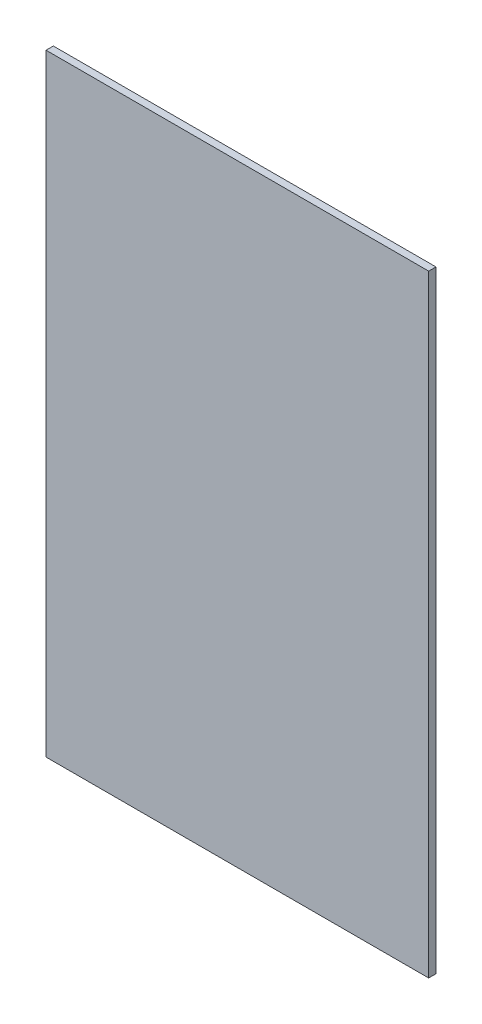
ISO-10303-21;
HEADER;
FILE_DESCRIPTION(('STEP AP214'),'2;1');
FILE_NAME('part.step','',(''),(''),'','','');
FILE_SCHEMA(('AUTOMOTIVE_DESIGN { 1 0 10303 214 1 1 1 1 }'));
ENDSEC;
DATA;
#1=APPLICATION_CONTEXT('core data for automotive mechanical design processes');
#2=APPLICATION_PROTOCOL_DEFINITION('international standard','automotive_design',2000,#1);
#3=PRODUCT_CONTEXT('',#1,'mechanical');
#4=PRODUCT('Part','Part','',(#3));
#5=PRODUCT_RELATED_PRODUCT_CATEGORY('part','',(#4));
#6=PRODUCT_DEFINITION_FORMATION('','',#4);
#7=PRODUCT_DEFINITION_CONTEXT('part definition',#1,'design');
#8=PRODUCT_DEFINITION('design','',#6,#7);
#9=PRODUCT_DEFINITION_SHAPE('','',#8);
#10=(LENGTH_UNIT() NAMED_UNIT(*) SI_UNIT(.MILLI.,.METRE.));
#11=(NAMED_UNIT(*) PLANE_ANGLE_UNIT() SI_UNIT($,.RADIAN.));
#12=(NAMED_UNIT(*) SI_UNIT($,.STERADIAN.) SOLID_ANGLE_UNIT());
#13=UNCERTAINTY_MEASURE_WITH_UNIT(LENGTH_MEASURE(1.E-05),#10,'distance_accuracy_value','');
#14=(GEOMETRIC_REPRESENTATION_CONTEXT(3) GLOBAL_UNCERTAINTY_ASSIGNED_CONTEXT((#13)) GLOBAL_UNIT_ASSIGNED_CONTEXT((#10,
#11,#12)) REPRESENTATION_CONTEXT('',''));
#15=CARTESIAN_POINT('',(0.,0.,0.));
#16=DIRECTION('',(0.,0.,1.));
#17=DIRECTION('',(1.,0.,0.));
#18=AXIS2_PLACEMENT_3D('',#15,#16,#17);
#19=CARTESIAN_POINT('',(0.,0.,8.));
#20=DIRECTION('',(1.,0.,0.));
#21=DIRECTION('',(0.,0.,-1.));
#22=AXIS2_PLACEMENT_3D('',#19,#20,#21);
#23=PLANE('',#22);
#24=DIRECTION('',(0.,-1.,0.));
#25=VECTOR('',#24,1.);
#26=CARTESIAN_POINT('',(0.,0.,0.));
#27=LINE('',#26,#25);
#28=CARTESIAN_POINT('',(0.,672.,0.));
#29=VERTEX_POINT('',#28);
#30=CARTESIAN_POINT('',(0.,0.,0.));
#31=VERTEX_POINT('',#30);
#32=EDGE_CURVE('E102',#29,#31,#27,.T.);
#33=ORIENTED_EDGE('',*,*,#32,.T.);
#34=DIRECTION('',(0.,0.,-1.));
#35=VECTOR('',#34,1.);
#36=CARTESIAN_POINT('',(0.,0.,8.));
#37=LINE('',#36,#35);
#38=CARTESIAN_POINT('',(0.,0.,8.));
#39=VERTEX_POINT('',#38);
#40=EDGE_CURVE('E11',#39,#31,#37,.T.);
#41=ORIENTED_EDGE('',*,*,#40,.F.);
#42=DIRECTION('',(0.,-1.,0.));
#43=VECTOR('',#42,1.);
#44=CARTESIAN_POINT('',(0.,0.,8.));
#45=LINE('',#44,#43);
#46=CARTESIAN_POINT('',(0.,672.,8.));
#47=VERTEX_POINT('',#46);
#48=EDGE_CURVE('E90',#47,#39,#45,.T.);
#49=ORIENTED_EDGE('',*,*,#48,.F.);
#50=DIRECTION('',(0.,0.,-1.));
#51=VECTOR('',#50,1.);
#52=CARTESIAN_POINT('',(0.,672.,8.));
#53=LINE('',#52,#51);
#54=EDGE_CURVE('E98',#47,#29,#53,.T.);
#55=ORIENTED_EDGE('',*,*,#54,.T.);
#56=EDGE_LOOP('',(#33,#41,#49,#55));
#57=FACE_BOUND('',#56,.T.);
#58=ADVANCED_FACE('F39',(#57),#23,.F.);
#59=CARTESIAN_POINT('',(0.,0.,8.));
#60=DIRECTION('',(0.,1.,0.));
#61=DIRECTION('',(0.,0.,1.));
#62=AXIS2_PLACEMENT_3D('',#59,#60,#61);
#63=PLANE('',#62);
#64=DIRECTION('',(1.,0.,0.));
#65=VECTOR('',#64,1.);
#66=CARTESIAN_POINT('',(0.,0.,0.));
#67=LINE('',#66,#65);
#68=CARTESIAN_POINT('',(420.,0.,0.));
#69=VERTEX_POINT('',#68);
#70=EDGE_CURVE('E94',#31,#69,#67,.T.);
#71=ORIENTED_EDGE('',*,*,#70,.T.);
#72=DIRECTION('',(0.,0.,-1.));
#73=VECTOR('',#72,1.);
#74=CARTESIAN_POINT('',(420.,0.,8.));
#75=LINE('',#74,#73);
#76=CARTESIAN_POINT('',(420.,0.,8.));
#77=VERTEX_POINT('',#76);
#78=EDGE_CURVE('E47',#77,#69,#75,.T.);
#79=ORIENTED_EDGE('',*,*,#78,.F.);
#80=DIRECTION('',(1.,0.,0.));
#81=VECTOR('',#80,1.);
#82=CARTESIAN_POINT('',(0.,0.,8.));
#83=LINE('',#82,#81);
#84=EDGE_CURVE('E85',#39,#77,#83,.T.);
#85=ORIENTED_EDGE('',*,*,#84,.F.);
#86=ORIENTED_EDGE('',*,*,#40,.T.);
#87=EDGE_LOOP('',(#71,#79,#85,#86));
#88=FACE_BOUND('',#87,.T.);
#89=ADVANCED_FACE('F93',(#88),#63,.F.);
#90=CARTESIAN_POINT('',(420.,0.,8.));
#91=DIRECTION('',(-1.,0.,0.));
#92=DIRECTION('',(0.,0.,1.));
#93=AXIS2_PLACEMENT_3D('',#90,#91,#92);
#94=PLANE('',#93);
#95=DIRECTION('',(0.,1.,0.));
#96=VECTOR('',#95,1.);
#97=CARTESIAN_POINT('',(420.,0.,0.));
#98=LINE('',#97,#96);
#99=CARTESIAN_POINT('',(420.,672.,0.));
#100=VERTEX_POINT('',#99);
#101=EDGE_CURVE('E72',#69,#100,#98,.T.);
#102=ORIENTED_EDGE('',*,*,#101,.T.);
#103=DIRECTION('',(0.,0.,-1.));
#104=VECTOR('',#103,1.);
#105=CARTESIAN_POINT('',(420.,672.,8.));
#106=LINE('',#105,#104);
#107=CARTESIAN_POINT('',(420.,672.,8.));
#108=VERTEX_POINT('',#107);
#109=EDGE_CURVE('E95',#108,#100,#106,.T.);
#110=ORIENTED_EDGE('',*,*,#109,.F.);
#111=DIRECTION('',(0.,1.,0.));
#112=VECTOR('',#111,1.);
#113=CARTESIAN_POINT('',(420.,0.,8.));
#114=LINE('',#113,#112);
#115=EDGE_CURVE('E88',#77,#108,#114,.T.);
#116=ORIENTED_EDGE('',*,*,#115,.F.);
#117=ORIENTED_EDGE('',*,*,#78,.T.);
#118=EDGE_LOOP('',(#102,#110,#116,#117));
#119=FACE_BOUND('',#118,.T.);
#120=ADVANCED_FACE('F96',(#119),#94,.F.);
#121=CARTESIAN_POINT('',(0.,672.,8.));
#122=DIRECTION('',(0.,-1.,0.));
#123=DIRECTION('',(0.,0.,-1.));
#124=AXIS2_PLACEMENT_3D('',#121,#122,#123);
#125=PLANE('',#124);
#126=DIRECTION('',(-1.,0.,0.));
#127=VECTOR('',#126,1.);
#128=CARTESIAN_POINT('',(0.,672.,0.));
#129=LINE('',#128,#127);
#130=EDGE_CURVE('E78',#100,#29,#129,.T.);
#131=ORIENTED_EDGE('',*,*,#130,.T.);
#132=ORIENTED_EDGE('',*,*,#54,.F.);
#133=DIRECTION('',(-1.,0.,0.));
#134=VECTOR('',#133,1.);
#135=CARTESIAN_POINT('',(0.,672.,8.));
#136=LINE('',#135,#134);
#137=EDGE_CURVE('E55',#108,#47,#136,.T.);
#138=ORIENTED_EDGE('',*,*,#137,.F.);
#139=ORIENTED_EDGE('',*,*,#109,.T.);
#140=EDGE_LOOP('',(#131,#132,#138,#139));
#141=FACE_BOUND('',#140,.T.);
#142=ADVANCED_FACE('F109',(#141),#125,.F.);
#143=CARTESIAN_POINT('',(0.,0.,8.));
#144=DIRECTION('',(0.,0.,-1.));
#145=DIRECTION('',(-1.,0.,0.));
#146=AXIS2_PLACEMENT_3D('',#143,#144,#145);
#147=PLANE('',#146);
#148=ORIENTED_EDGE('',*,*,#48,.T.);
#149=ORIENTED_EDGE('',*,*,#84,.T.);
#150=ORIENTED_EDGE('',*,*,#115,.T.);
#151=ORIENTED_EDGE('',*,*,#137,.T.);
#152=EDGE_LOOP('',(#148,#149,#150,#151));
#153=FACE_BOUND('',#152,.T.);
#154=ADVANCED_FACE('F86',(#153),#147,.F.);
#155=CARTESIAN_POINT('',(0.,0.,0.));
#156=DIRECTION('',(0.,0.,-1.));
#157=DIRECTION('',(-1.,0.,0.));
#158=AXIS2_PLACEMENT_3D('',#155,#156,#157);
#159=PLANE('',#158);
#160=ORIENTED_EDGE('',*,*,#32,.F.);
#161=ORIENTED_EDGE('',*,*,#130,.F.);
#162=ORIENTED_EDGE('',*,*,#101,.F.);
#163=ORIENTED_EDGE('',*,*,#70,.F.);
#164=EDGE_LOOP('',(#160,#161,#162,#163));
#165=FACE_BOUND('',#164,.T.);
#166=ADVANCED_FACE('F112',(#165),#159,.T.);
#167=CLOSED_SHELL('',(#58,#89,#120,#142,#154,#166));
#168=MANIFOLD_SOLID_BREP('B2',#167);
#169=ADVANCED_BREP_SHAPE_REPRESENTATION('',(#18,#168),#14);
#170=SHAPE_DEFINITION_REPRESENTATION(#9,#169);
ENDSEC;
END-ISO-10303-21;
